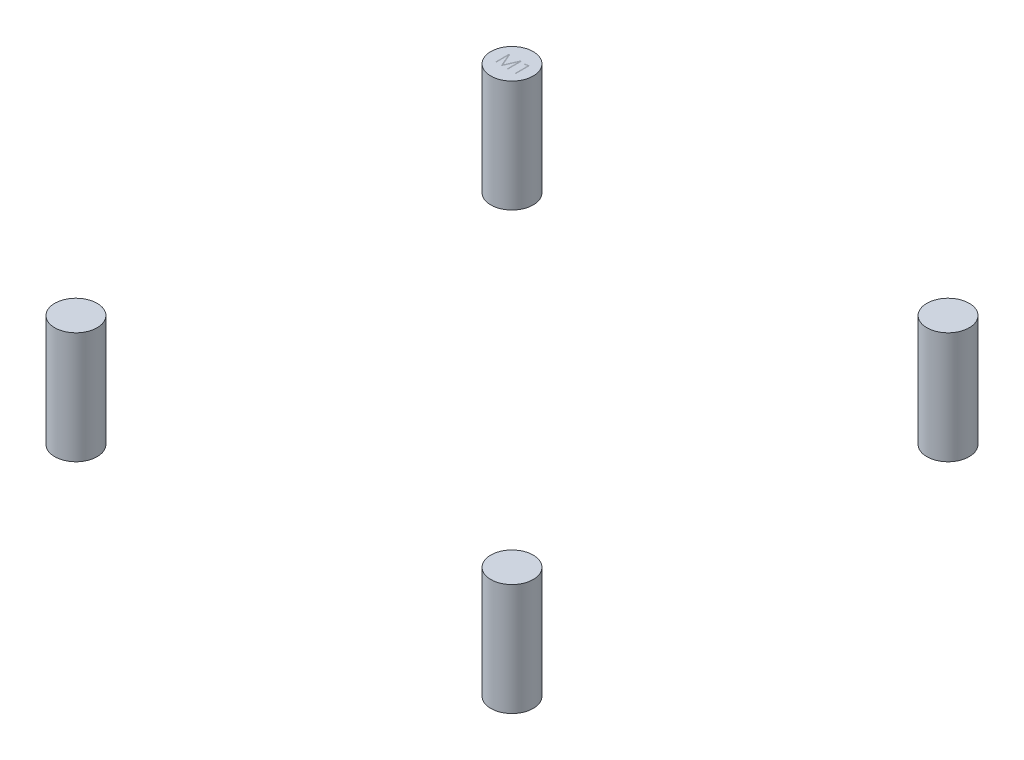
ISO-10303-21;
HEADER;
FILE_DESCRIPTION(('STEP AP214'),'2;1');
FILE_NAME('part.step','',(''),(''),'','','');
FILE_SCHEMA(('AUTOMOTIVE_DESIGN { 1 0 10303 214 1 1 1 1 }'));
ENDSEC;
DATA;
#1=APPLICATION_CONTEXT('core data for automotive mechanical design processes');
#2=APPLICATION_PROTOCOL_DEFINITION('international standard','automotive_design',2000,#1);
#3=PRODUCT_CONTEXT('',#1,'mechanical');
#4=PRODUCT('Part','Part','',(#3));
#5=PRODUCT_RELATED_PRODUCT_CATEGORY('part','',(#4));
#6=PRODUCT_DEFINITION_FORMATION('','',#4);
#7=PRODUCT_DEFINITION_CONTEXT('part definition',#1,'design');
#8=PRODUCT_DEFINITION('design','',#6,#7);
#9=PRODUCT_DEFINITION_SHAPE('','',#8);
#10=(LENGTH_UNIT() NAMED_UNIT(*) SI_UNIT(.MILLI.,.METRE.));
#11=(NAMED_UNIT(*) PLANE_ANGLE_UNIT() SI_UNIT($,.RADIAN.));
#12=(NAMED_UNIT(*) SI_UNIT($,.STERADIAN.) SOLID_ANGLE_UNIT());
#13=UNCERTAINTY_MEASURE_WITH_UNIT(LENGTH_MEASURE(1.E-05),#10,'distance_accuracy_value','');
#14=(GEOMETRIC_REPRESENTATION_CONTEXT(3) GLOBAL_UNCERTAINTY_ASSIGNED_CONTEXT((#13)) GLOBAL_UNIT_ASSIGNED_CONTEXT((#10,
#11,#12)) REPRESENTATION_CONTEXT('',''));
#15=CARTESIAN_POINT('',(0.,0.,0.));
#16=DIRECTION('',(0.,0.,1.));
#17=DIRECTION('',(1.,0.,0.));
#18=AXIS2_PLACEMENT_3D('',#15,#16,#17);
#19=CARTESIAN_POINT('',(-30.4449999999984,15.6,30.445));
#20=DIRECTION('',(0.,-1.,0.));
#21=DIRECTION('',(0.,0.,-1.));
#22=AXIS2_PLACEMENT_3D('',#19,#20,#21);
#23=CYLINDRICAL_SURFACE('',#22,2.96000000000092);
#24=CARTESIAN_POINT('',(-30.4449999999984,15.6,30.445));
#25=DIRECTION('',(0.,1.,0.));
#26=DIRECTION('',(0.,0.,1.));
#27=AXIS2_PLACEMENT_3D('',#24,#25,#26);
#28=CIRCLE('',#27,2.96000000000092);
#29=CARTESIAN_POINT('',(-30.4449999999984,15.6,33.4050000000009));
#30=VERTEX_POINT('',#29);
#31=EDGE_CURVE('E11',#30,#30,#28,.T.);
#32=ORIENTED_EDGE('',*,*,#31,.F.);
#33=EDGE_LOOP('',(#32));
#34=FACE_BOUND('',#33,.T.);
#35=CARTESIAN_POINT('',(-30.4449999999984,0.,30.445));
#36=DIRECTION('',(0.,1.,0.));
#37=DIRECTION('',(0.,0.,1.));
#38=AXIS2_PLACEMENT_3D('',#35,#36,#37);
#39=CIRCLE('',#38,2.96000000000092);
#40=CARTESIAN_POINT('',(-30.4449999999984,0.,33.4050000000009));
#41=VERTEX_POINT('',#40);
#42=EDGE_CURVE('E47',#41,#41,#39,.T.);
#43=ORIENTED_EDGE('',*,*,#42,.T.);
#44=EDGE_LOOP('',(#43));
#45=FACE_BOUND('',#44,.T.);
#46=ADVANCED_FACE('F44',(#34,#45),#23,.T.);
#47=CARTESIAN_POINT('',(-30.4449999999984,15.6,30.445));
#48=DIRECTION('',(0.,1.,0.));
#49=DIRECTION('',(0.,0.,1.));
#50=AXIS2_PLACEMENT_3D('',#47,#48,#49);
#51=PLANE('',#50);
#52=ORIENTED_EDGE('',*,*,#31,.T.);
#53=EDGE_LOOP('',(#52));
#54=FACE_BOUND('',#53,.T.);
#55=ADVANCED_FACE('F59',(#54),#51,.T.);
#56=CARTESIAN_POINT('',(-30.4449999999984,0.,30.445));
#57=DIRECTION('',(0.,1.,0.));
#58=DIRECTION('',(0.,0.,1.));
#59=AXIS2_PLACEMENT_3D('',#56,#57,#58);
#60=PLANE('',#59);
#61=ORIENTED_EDGE('',*,*,#42,.F.);
#62=EDGE_LOOP('',(#61));
#63=FACE_BOUND('',#62,.T.);
#64=ADVANCED_FACE('F57',(#63),#60,.F.);
#65=CLOSED_SHELL('',(#46,#55,#64));
#66=MANIFOLD_SOLID_BREP('B2',#65);
#67=CARTESIAN_POINT('',(30.4450000000017,15.6,30.4449999999984));
#68=DIRECTION('',(0.,-1.,0.));
#69=DIRECTION('',(0.,0.,-1.));
#70=AXIS2_PLACEMENT_3D('',#67,#68,#69);
#71=CYLINDRICAL_SURFACE('',#70,2.9600000000024);
#72=CARTESIAN_POINT('',(30.4450000000017,15.6,30.4449999999984));
#73=DIRECTION('',(0.,1.,0.));
#74=DIRECTION('',(0.,0.,1.));
#75=AXIS2_PLACEMENT_3D('',#72,#73,#74);
#76=CIRCLE('',#75,2.9600000000024);
#77=CARTESIAN_POINT('',(30.4450000000017,15.6,33.4050000000009));
#78=VERTEX_POINT('',#77);
#79=EDGE_CURVE('E43',#78,#78,#76,.T.);
#80=ORIENTED_EDGE('',*,*,#79,.F.);
#81=EDGE_LOOP('',(#80));
#82=FACE_BOUND('',#81,.T.);
#83=CARTESIAN_POINT('',(30.4450000000017,0.,30.4449999999984));
#84=DIRECTION('',(0.,1.,0.));
#85=DIRECTION('',(0.,0.,1.));
#86=AXIS2_PLACEMENT_3D('',#83,#84,#85);
#87=CIRCLE('',#86,2.9600000000024);
#88=CARTESIAN_POINT('',(30.4450000000017,0.,33.4050000000009));
#89=VERTEX_POINT('',#88);
#90=EDGE_CURVE('E96',#89,#89,#87,.T.);
#91=ORIENTED_EDGE('',*,*,#90,.T.);
#92=EDGE_LOOP('',(#91));
#93=FACE_BOUND('',#92,.T.);
#94=ADVANCED_FACE('F93',(#82,#93),#71,.T.);
#95=CARTESIAN_POINT('',(30.4450000000017,15.6,30.4449999999984));
#96=DIRECTION('',(0.,1.,0.));
#97=DIRECTION('',(0.,0.,1.));
#98=AXIS2_PLACEMENT_3D('',#95,#96,#97);
#99=PLANE('',#98);
#100=ORIENTED_EDGE('',*,*,#79,.T.);
#101=EDGE_LOOP('',(#100));
#102=FACE_BOUND('',#101,.T.);
#103=ADVANCED_FACE('F108',(#102),#99,.T.);
#104=CARTESIAN_POINT('',(30.4450000000017,0.,30.4449999999984));
#105=DIRECTION('',(0.,1.,0.));
#106=DIRECTION('',(0.,0.,1.));
#107=AXIS2_PLACEMENT_3D('',#104,#105,#106);
#108=PLANE('',#107);
#109=ORIENTED_EDGE('',*,*,#90,.F.);
#110=EDGE_LOOP('',(#109));
#111=FACE_BOUND('',#110,.T.);
#112=ADVANCED_FACE('F106',(#111),#108,.F.);
#113=CLOSED_SHELL('',(#94,#103,#112));
#114=MANIFOLD_SOLID_BREP('B6',#113);
#115=CARTESIAN_POINT('',(30.4450000000002,15.6,-30.4450000000016));
#116=DIRECTION('',(0.,-1.,0.));
#117=DIRECTION('',(0.,0.,-1.));
#118=AXIS2_PLACEMENT_3D('',#115,#116,#117);
#119=CYLINDRICAL_SURFACE('',#118,2.96000000000177);
#120=CARTESIAN_POINT('',(30.4450000000002,15.6,-30.4450000000016));
#121=DIRECTION('',(0.,1.,0.));
#122=DIRECTION('',(0.,0.,1.));
#123=AXIS2_PLACEMENT_3D('',#120,#121,#122);
#124=CIRCLE('',#123,2.96000000000177);
#125=CARTESIAN_POINT('',(30.4450000000002,15.6,-27.4849999999999));
#126=VERTEX_POINT('',#125);
#127=EDGE_CURVE('E92',#126,#126,#124,.T.);
#128=ORIENTED_EDGE('',*,*,#127,.F.);
#129=EDGE_LOOP('',(#128));
#130=FACE_BOUND('',#129,.T.);
#131=CARTESIAN_POINT('',(30.4450000000002,0.,-30.4450000000016));
#132=DIRECTION('',(0.,1.,0.));
#133=DIRECTION('',(0.,0.,1.));
#134=AXIS2_PLACEMENT_3D('',#131,#132,#133);
#135=CIRCLE('',#134,2.96000000000177);
#136=CARTESIAN_POINT('',(30.4450000000002,0.,-27.4849999999999));
#137=VERTEX_POINT('',#136);
#138=EDGE_CURVE('E146',#137,#137,#135,.T.);
#139=ORIENTED_EDGE('',*,*,#138,.T.);
#140=EDGE_LOOP('',(#139));
#141=FACE_BOUND('',#140,.T.);
#142=ADVANCED_FACE('F143',(#130,#141),#119,.T.);
#143=CARTESIAN_POINT('',(30.4450000000002,15.6,-30.4450000000016));
#144=DIRECTION('',(0.,1.,0.));
#145=DIRECTION('',(0.,0.,1.));
#146=AXIS2_PLACEMENT_3D('',#143,#144,#145);
#147=PLANE('',#146);
#148=ORIENTED_EDGE('',*,*,#127,.T.);
#149=EDGE_LOOP('',(#148));
#150=FACE_BOUND('',#149,.T.);
#151=ADVANCED_FACE('F158',(#150),#147,.T.);
#152=CARTESIAN_POINT('',(30.4450000000002,0.,-30.4450000000016));
#153=DIRECTION('',(0.,1.,0.));
#154=DIRECTION('',(0.,0.,1.));
#155=AXIS2_PLACEMENT_3D('',#152,#153,#154);
#156=PLANE('',#155);
#157=ORIENTED_EDGE('',*,*,#138,.F.);
#158=EDGE_LOOP('',(#157));
#159=FACE_BOUND('',#158,.T.);
#160=ADVANCED_FACE('F156',(#159),#156,.F.);
#161=CLOSED_SHELL('',(#142,#151,#160));
#162=MANIFOLD_SOLID_BREP('B38',#161);
#163=CARTESIAN_POINT('',(-30.4449999999999,15.6,-30.4450000000001));
#164=DIRECTION('',(0.,1.,0.));
#165=DIRECTION('',(0.,0.,1.));
#166=AXIS2_PLACEMENT_3D('',#163,#164,#165);
#167=PLANE('',#166);
#168=DIRECTION('',(1.,0.,0.));
#169=VECTOR('',#168,1.);
#170=CARTESIAN_POINT('',(-30.4449999999999,15.6,-29.5423565907152));
#171=LINE('',#170,#169);
#172=CARTESIAN_POINT('',(-29.0642741816603,15.6,-29.5423565907152));
#173=VERTEX_POINT('',#172);
#174=CARTESIAN_POINT('',(-28.9960133337402,15.6,-29.5423565907152));
#175=VERTEX_POINT('',#174);
#176=EDGE_CURVE('E193',#173,#175,#171,.T.);
#177=ORIENTED_EDGE('',*,*,#176,.T.);
#178=DIRECTION('',(0.,0.,-1.));
#179=VECTOR('',#178,1.);
#180=CARTESIAN_POINT('',(-28.9960133337402,15.6,-30.4450000000001));
#181=LINE('',#180,#179);
#182=CARTESIAN_POINT('',(-28.9960133337402,15.6,-31.4086531800037));
#183=VERTEX_POINT('',#182);
#184=EDGE_CURVE('E141',#175,#183,#181,.T.);
#185=ORIENTED_EDGE('',*,*,#184,.T.);
#186=DIRECTION('',(-0.983329007094552,0.,0.181835265574206));
#187=VECTOR('',#186,1.);
#188=CARTESIAN_POINT('',(-30.5693955507176,15.6,-31.1177064356184));
#189=LINE('',#188,#187);
#190=CARTESIAN_POINT('',(-29.5679792297741,15.6,-31.302886371688));
#191=VERTEX_POINT('',#190);
#192=EDGE_CURVE('E272',#183,#191,#189,.T.);
#193=ORIENTED_EDGE('',*,*,#192,.T.);
#194=DIRECTION('',(0.,0.,1.));
#195=VECTOR('',#194,1.);
#196=CARTESIAN_POINT('',(-29.5679792297741,15.6,-30.4450000000001));
#197=LINE('',#196,#195);
#198=CARTESIAN_POINT('',(-29.5679792297741,15.6,-31.2443770734707));
#199=VERTEX_POINT('',#198);
#200=EDGE_CURVE('E341',#191,#199,#197,.T.);
#201=ORIENTED_EDGE('',*,*,#200,.T.);
#202=DIRECTION('',(0.981221667736255,0.,-0.192883484945918));
#203=VECTOR('',#202,1.);
#204=CARTESIAN_POINT('',(-30.5636625531076,15.6,-31.0486507909986));
#205=LINE('',#204,#203);
#206=CARTESIAN_POINT('',(-29.0642741816603,15.6,-31.3433928089153));
#207=VERTEX_POINT('',#206);
#208=EDGE_CURVE('E345',#199,#207,#205,.T.);
#209=ORIENTED_EDGE('',*,*,#208,.T.);
#210=DIRECTION('',(0.,0.,1.));
#211=VECTOR('',#210,1.);
#212=CARTESIAN_POINT('',(-29.0642741816603,15.6,-30.4450000000001));
#213=LINE('',#212,#211);
#214=EDGE_CURVE('E349',#207,#173,#213,.T.);
#215=ORIENTED_EDGE('',*,*,#214,.T.);
#216=EDGE_LOOP('',(#177,#185,#193,#201,#209,#215));
#217=FACE_BOUND('',#216,.T.);
#218=ADVANCED_FACE('F184',(#217),#167,.T.);
#219=DIRECTION('',(-0.397879489186752,0.,-0.917437688393326));
#220=VECTOR('',#219,1.);
#221=CARTESIAN_POINT('',(-31.1660816913755,15.6,-30.1322772738073));
#222=LINE('',#221,#220);
#223=CARTESIAN_POINT('',(-30.9575750624337,15.6,-29.6514989354666));
#224=VERTEX_POINT('',#223);
#225=CARTESIAN_POINT('',(-31.7118199259906,15.6,-31.3906503190138));
#226=VERTEX_POINT('',#225);
#227=EDGE_CURVE('E269',#224,#226,#222,.T.);
#228=ORIENTED_EDGE('',*,*,#227,.T.);
#229=DIRECTION('',(-1.,0.,0.));
#230=VECTOR('',#229,1.);
#231=CARTESIAN_POINT('',(-30.4449999999999,15.6,-31.3906503190138));
#232=LINE('',#231,#230);
#233=CARTESIAN_POINT('',(-31.8093354230194,15.6,-31.3906503190138));
#234=VERTEX_POINT('',#233);
#235=EDGE_CURVE('E263',#226,#234,#232,.T.);
#236=ORIENTED_EDGE('',*,*,#235,.T.);
#237=DIRECTION('',(0.,0.,1.));
#238=VECTOR('',#237,1.);
#239=CARTESIAN_POINT('',(-31.8093354230194,15.6,-30.4450000000001));
#240=LINE('',#239,#238);
#241=CARTESIAN_POINT('',(-31.8093354230194,15.6,-29.5423565907152));
#242=VERTEX_POINT('',#241);
#243=EDGE_CURVE('E267',#234,#242,#240,.T.);
#244=ORIENTED_EDGE('',*,*,#243,.T.);
#245=DIRECTION('',(1.,0.,0.));
#246=VECTOR('',#245,1.);
#247=CARTESIAN_POINT('',(-30.4449999999999,15.6,-29.5423565907152));
#248=LINE('',#247,#246);
#249=CARTESIAN_POINT('',(-31.7410745750993,15.6,-29.5423565907152));
#250=VERTEX_POINT('',#249);
#251=EDGE_CURVE('E276',#242,#250,#248,.T.);
#252=ORIENTED_EDGE('',*,*,#251,.T.);
#253=DIRECTION('',(0.,0.,-1.));
#254=VECTOR('',#253,1.);
#255=CARTESIAN_POINT('',(-31.7410745750993,15.6,-30.4450000000001));
#256=LINE('',#255,#254);
#257=CARTESIAN_POINT('',(-31.7410745750993,15.6,-31.2537535635696));
#258=VERTEX_POINT('',#257);
#259=EDGE_CURVE('E283',#250,#258,#256,.T.);
#260=ORIENTED_EDGE('',*,*,#259,.T.);
#261=DIRECTION('',(0.948683298050597,0.,-0.316227766016587));
#262=VECTOR('',#261,1.);
#263=CARTESIAN_POINT('',(-30.8172335265803,15.6,-31.5617005797423));
#264=LINE('',#263,#262);
#265=CARTESIAN_POINT('',(-31.7331983234162,15.6,-31.2563789807973));
#266=VERTEX_POINT('',#265);
#267=EDGE_CURVE('E293',#258,#266,#264,.T.);
#268=ORIENTED_EDGE('',*,*,#267,.T.);
#269=DIRECTION('',(0.402268611177705,0.,0.91552168978193));
#270=VECTOR('',#269,1.);
#271=CARTESIAN_POINT('',(-31.2259227988085,15.6,-30.1018724332589));
#272=LINE('',#271,#270);
#273=CARTESIAN_POINT('',(-30.9800786386711,15.6,-29.5423565907152));
#274=VERTEX_POINT('',#273);
#275=EDGE_CURVE('E297',#266,#274,#272,.T.);
#276=ORIENTED_EDGE('',*,*,#275,.T.);
#277=DIRECTION('',(1.,0.,0.));
#278=VECTOR('',#277,1.);
#279=CARTESIAN_POINT('',(-30.4449999999999,15.6,-29.5423565907152));
#280=LINE('',#279,#278);
#281=CARTESIAN_POINT('',(-30.9256949960974,15.6,-29.5423565907152));
#282=VERTEX_POINT('',#281);
#283=EDGE_CURVE('E301',#274,#282,#280,.T.);
#284=ORIENTED_EDGE('',*,*,#283,.T.);
#285=DIRECTION('',(0.402250916438696,0.,-0.91552946442167));
#286=VECTOR('',#285,1.);
#287=CARTESIAN_POINT('',(-30.5154969532038,15.6,-30.475973840968));
#288=LINE('',#287,#286);
#289=CARTESIAN_POINT('',(-30.1688247153128,15.6,-31.2650053516883));
#290=VERTEX_POINT('',#289);
#291=EDGE_CURVE('E305',#282,#290,#288,.T.);
#292=ORIENTED_EDGE('',*,*,#291,.T.);
#293=DIRECTION('',(0.943858356366051,0.,0.330350424728009));
#294=VECTOR('',#293,1.);
#295=CARTESIAN_POINT('',(-30.1591796476926,15.6,-31.2616295780213));
#296=LINE('',#295,#294);
#297=CARTESIAN_POINT('',(-30.1613235232336,15.6,-31.2623799344606));
#298=VERTEX_POINT('',#297);
#299=EDGE_CURVE('E309',#290,#298,#296,.T.);
#300=ORIENTED_EDGE('',*,*,#299,.T.);
#301=DIRECTION('',(0.,0.,1.));
#302=VECTOR('',#301,1.);
#303=CARTESIAN_POINT('',(-30.1613235232336,15.6,-30.4450000000001));
#304=LINE('',#303,#302);
#305=CARTESIAN_POINT('',(-30.1613235232336,15.6,-29.5423565907152));
#306=VERTEX_POINT('',#305);
#307=EDGE_CURVE('E313',#298,#306,#304,.T.);
#308=ORIENTED_EDGE('',*,*,#307,.T.);
#309=DIRECTION('',(1.,0.,0.));
#310=VECTOR('',#309,1.);
#311=CARTESIAN_POINT('',(-30.4449999999999,15.6,-29.5423565907152));
#312=LINE('',#311,#310);
#313=CARTESIAN_POINT('',(-30.0926876157096,15.6,-29.5423565907152));
#314=VERTEX_POINT('',#313);
#315=EDGE_CURVE('E317',#306,#314,#312,.T.);
#316=ORIENTED_EDGE('',*,*,#315,.T.);
#317=DIRECTION('',(0.,0.,-1.));
#318=VECTOR('',#317,1.);
#319=CARTESIAN_POINT('',(-30.0926876157096,15.6,-30.4450000000001));
#320=LINE('',#319,#318);
#321=CARTESIAN_POINT('',(-30.0926876157096,15.6,-31.3906503190138));
#322=VERTEX_POINT('',#321);
#323=EDGE_CURVE('E321',#314,#322,#320,.T.);
#324=ORIENTED_EDGE('',*,*,#323,.T.);
#325=DIRECTION('',(-1.,0.,0.));
#326=VECTOR('',#325,1.);
#327=CARTESIAN_POINT('',(-30.4449999999999,15.6,-31.3906503190138));
#328=LINE('',#327,#326);
#329=CARTESIAN_POINT('',(-30.192828529966,15.6,-31.3906503190138));
#330=VERTEX_POINT('',#329);
#331=EDGE_CURVE('E325',#322,#330,#328,.T.);
#332=ORIENTED_EDGE('',*,*,#331,.T.);
#333=DIRECTION('',(-0.399044235823217,0.,0.916931675675055));
#334=VECTOR('',#333,1.);
#335=CARTESIAN_POINT('',(-30.5789933350128,15.6,-30.5033132521149));
#336=LINE('',#335,#334);
#337=CARTESIAN_POINT('',(-30.9496988107506,15.6,-29.6514989354666));
#338=VERTEX_POINT('',#337);
#339=EDGE_CURVE('E329',#330,#338,#336,.T.);
#340=ORIENTED_EDGE('',*,*,#339,.T.);
#341=DIRECTION('',(-1.,0.,0.));
#342=VECTOR('',#341,1.);
#343=CARTESIAN_POINT('',(-30.4449999999999,15.6,-29.6514989354666));
#344=LINE('',#343,#342);
#345=EDGE_CURVE('E333',#338,#224,#344,.T.);
#346=ORIENTED_EDGE('',*,*,#345,.T.);
#347=EDGE_LOOP('',(#228,#236,#244,#252,#260,#268,#276,#284,#292,#300,#308,#316,#324,#332,#340,#346));
#348=FACE_BOUND('',#347,.T.);
#349=ADVANCED_FACE('F265',(#348),#167,.T.);
#350=CARTESIAN_POINT('',(-30.4449999999999,15.6,-30.4450000000001));
#351=DIRECTION('',(0.,-1.,0.));
#352=DIRECTION('',(0.,0.,-1.));
#353=AXIS2_PLACEMENT_3D('',#350,#351,#352);
#354=CYLINDRICAL_SURFACE('',#353,2.96);
#355=CARTESIAN_POINT('',(-30.4449999999999,15.6,-30.4450000000001));
#356=DIRECTION('',(0.,1.,0.));
#357=DIRECTION('',(0.,0.,1.));
#358=AXIS2_PLACEMENT_3D('',#355,#356,#357);
#359=CIRCLE('',#358,2.96);
#360=CARTESIAN_POINT('',(-30.4449999999999,15.6,-27.4850000000001));
#361=VERTEX_POINT('',#360);
#362=EDGE_CURVE('E278',#361,#361,#359,.T.);
#363=ORIENTED_EDGE('',*,*,#362,.F.);
#364=EDGE_LOOP('',(#363));
#365=FACE_BOUND('',#364,.T.);
#366=CARTESIAN_POINT('',(-30.4449999999999,0.,-30.4450000000001));
#367=DIRECTION('',(0.,1.,0.));
#368=DIRECTION('',(0.,0.,1.));
#369=AXIS2_PLACEMENT_3D('',#366,#367,#368);
#370=CIRCLE('',#369,2.96);
#371=CARTESIAN_POINT('',(-30.4449999999999,0.,-27.4850000000001));
#372=VERTEX_POINT('',#371);
#373=EDGE_CURVE('E286',#372,#372,#370,.T.);
#374=ORIENTED_EDGE('',*,*,#373,.T.);
#375=EDGE_LOOP('',(#374));
#376=FACE_BOUND('',#375,.T.);
#377=ADVANCED_FACE('F186',(#365,#376),#354,.T.);
#378=ORIENTED_EDGE('',*,*,#184,.F.);
#379=ORIENTED_EDGE('',*,*,#176,.F.);
#380=ORIENTED_EDGE('',*,*,#214,.F.);
#381=ORIENTED_EDGE('',*,*,#208,.F.);
#382=ORIENTED_EDGE('',*,*,#200,.F.);
#383=ORIENTED_EDGE('',*,*,#192,.F.);
#384=EDGE_LOOP('',(#378,#379,#380,#381,#382,#383));
#385=FACE_BOUND('',#384,.T.);
#386=ORIENTED_EDGE('',*,*,#235,.F.);
#387=ORIENTED_EDGE('',*,*,#227,.F.);
#388=ORIENTED_EDGE('',*,*,#345,.F.);
#389=ORIENTED_EDGE('',*,*,#339,.F.);
#390=ORIENTED_EDGE('',*,*,#331,.F.);
#391=ORIENTED_EDGE('',*,*,#323,.F.);
#392=ORIENTED_EDGE('',*,*,#315,.F.);
#393=ORIENTED_EDGE('',*,*,#307,.F.);
#394=ORIENTED_EDGE('',*,*,#299,.F.);
#395=ORIENTED_EDGE('',*,*,#291,.F.);
#396=ORIENTED_EDGE('',*,*,#283,.F.);
#397=ORIENTED_EDGE('',*,*,#275,.F.);
#398=ORIENTED_EDGE('',*,*,#267,.F.);
#399=ORIENTED_EDGE('',*,*,#259,.F.);
#400=ORIENTED_EDGE('',*,*,#251,.F.);
#401=ORIENTED_EDGE('',*,*,#243,.F.);
#402=EDGE_LOOP('',(#386,#387,#388,#389,#390,#391,#392,#393,#394,#395,#396,#397,#398,#399,#400,#401));
#403=FACE_BOUND('',#402,.T.);
#404=ORIENTED_EDGE('',*,*,#362,.T.);
#405=EDGE_LOOP('',(#404));
#406=FACE_BOUND('',#405,.T.);
#407=ADVANCED_FACE('F274',(#385,#403,#406),#167,.T.);
#408=CARTESIAN_POINT('',(-30.4449999999999,0.,-30.4450000000001));
#409=DIRECTION('',(0.,1.,0.));
#410=DIRECTION('',(0.,0.,1.));
#411=AXIS2_PLACEMENT_3D('',#408,#409,#410);
#412=PLANE('',#411);
#413=ORIENTED_EDGE('',*,*,#373,.F.);
#414=EDGE_LOOP('',(#413));
#415=FACE_BOUND('',#414,.T.);
#416=ADVANCED_FACE('F356',(#415),#412,.F.);
#417=CLOSED_SHELL('',(#218,#349,#377,#407,#416));
#418=MANIFOLD_SOLID_BREP('B87',#417);
#419=ADVANCED_BREP_SHAPE_REPRESENTATION('',(#18,#66,#114,#162,#418),#14);
#420=SHAPE_DEFINITION_REPRESENTATION(#9,#419);
ENDSEC;
END-ISO-10303-21;
